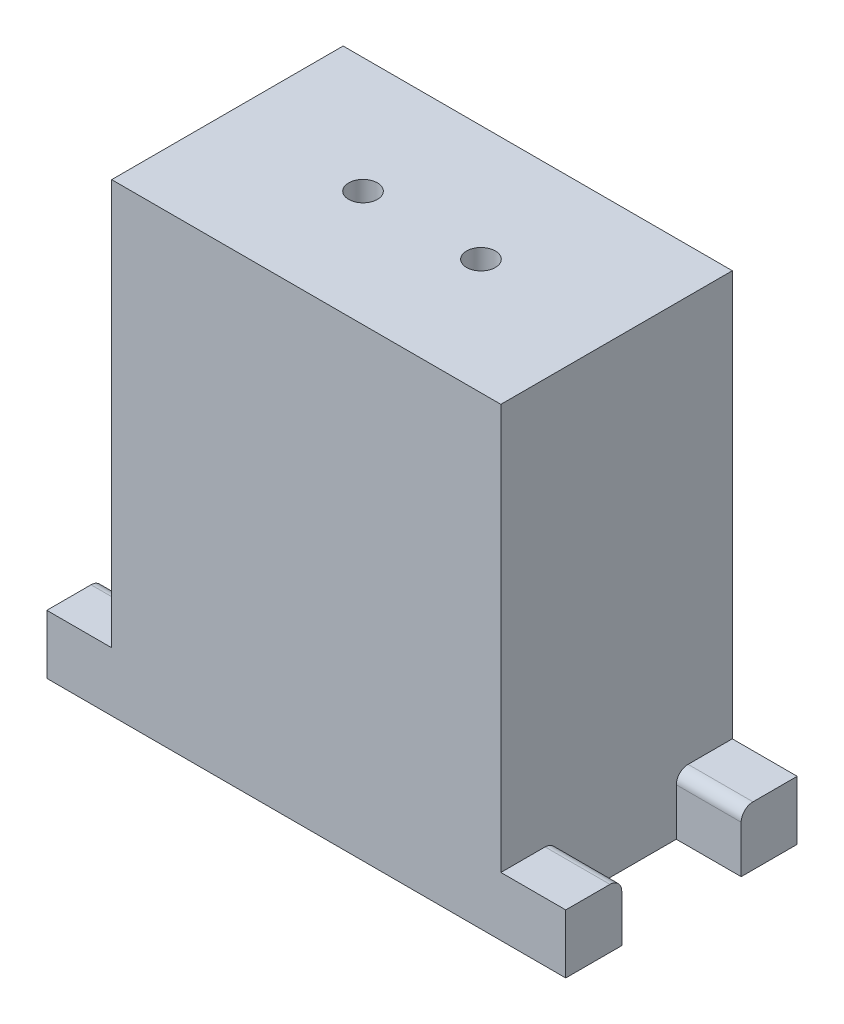
ISO-10303-21;
HEADER;
FILE_DESCRIPTION(('STEP AP214'),'2;1');
FILE_NAME('part.step','',(''),(''),'','','');
FILE_SCHEMA(('AUTOMOTIVE_DESIGN { 1 0 10303 214 1 1 1 1 }'));
ENDSEC;
DATA;
#1=APPLICATION_CONTEXT('core data for automotive mechanical design processes');
#2=APPLICATION_PROTOCOL_DEFINITION('international standard','automotive_design',2000,#1);
#3=PRODUCT_CONTEXT('',#1,'mechanical');
#4=PRODUCT('Part','Part','',(#3));
#5=PRODUCT_RELATED_PRODUCT_CATEGORY('part','',(#4));
#6=PRODUCT_DEFINITION_FORMATION('','',#4);
#7=PRODUCT_DEFINITION_CONTEXT('part definition',#1,'design');
#8=PRODUCT_DEFINITION('design','',#6,#7);
#9=PRODUCT_DEFINITION_SHAPE('','',#8);
#10=(LENGTH_UNIT() NAMED_UNIT(*) SI_UNIT(.MILLI.,.METRE.));
#11=(NAMED_UNIT(*) PLANE_ANGLE_UNIT() SI_UNIT($,.RADIAN.));
#12=(NAMED_UNIT(*) SI_UNIT($,.STERADIAN.) SOLID_ANGLE_UNIT());
#13=UNCERTAINTY_MEASURE_WITH_UNIT(LENGTH_MEASURE(1.E-05),#10,'distance_accuracy_value','');
#14=(GEOMETRIC_REPRESENTATION_CONTEXT(3) GLOBAL_UNCERTAINTY_ASSIGNED_CONTEXT((#13)) GLOBAL_UNIT_ASSIGNED_CONTEXT((#10,
#11,#12)) REPRESENTATION_CONTEXT('',''));
#15=CARTESIAN_POINT('',(0.,0.,0.));
#16=DIRECTION('',(0.,0.,1.));
#17=DIRECTION('',(1.,0.,0.));
#18=AXIS2_PLACEMENT_3D('',#15,#16,#17);
#19=CARTESIAN_POINT('',(-13.2,31.5,7.85));
#20=DIRECTION('',(1.,0.,0.));
#21=DIRECTION('',(0.,0.,-1.));
#22=AXIS2_PLACEMENT_3D('',#19,#20,#21);
#23=PLANE('',#22);
#24=DIRECTION('',(0.,1.,0.));
#25=VECTOR('',#24,1.);
#26=CARTESIAN_POINT('',(-13.2,4.,-4.05));
#27=LINE('',#26,#25);
#28=CARTESIAN_POINT('',(-13.2,0.,-4.05));
#29=VERTEX_POINT('',#28);
#30=CARTESIAN_POINT('',(-13.2,3.2,-4.05));
#31=VERTEX_POINT('',#30);
#32=EDGE_CURVE('E199',#29,#31,#27,.T.);
#33=ORIENTED_EDGE('',*,*,#32,.F.);
#34=DIRECTION('',(0.,0.,1.));
#35=VECTOR('',#34,1.);
#36=CARTESIAN_POINT('',(-13.2,0.,7.85));
#37=LINE('',#36,#35);
#38=CARTESIAN_POINT('',(-13.2,0.,4.05));
#39=VERTEX_POINT('',#38);
#40=EDGE_CURVE('E274',#29,#39,#37,.T.);
#41=ORIENTED_EDGE('',*,*,#40,.T.);
#42=DIRECTION('',(0.,-1.,0.));
#43=VECTOR('',#42,1.);
#44=CARTESIAN_POINT('',(-13.2,4.,4.05));
#45=LINE('',#44,#43);
#46=CARTESIAN_POINT('',(-13.2,3.2,4.05));
#47=VERTEX_POINT('',#46);
#48=EDGE_CURVE('E217',#47,#39,#45,.T.);
#49=ORIENTED_EDGE('',*,*,#48,.F.);
#50=CARTESIAN_POINT('',(-13.2,3.2,4.85));
#51=DIRECTION('',(1.,0.,0.));
#52=DIRECTION('',(0.,0.,-1.));
#53=AXIS2_PLACEMENT_3D('',#50,#51,#52);
#54=CIRCLE('',#53,0.8);
#55=CARTESIAN_POINT('',(-13.2,4.,4.85));
#56=VERTEX_POINT('',#55);
#57=EDGE_CURVE('E41',#47,#56,#54,.T.);
#58=ORIENTED_EDGE('',*,*,#57,.T.);
#59=DIRECTION('',(0.,0.,-1.));
#60=VECTOR('',#59,1.);
#61=CARTESIAN_POINT('',(-13.2,4.,4.05));
#62=LINE('',#61,#60);
#63=CARTESIAN_POINT('',(-13.2,4.,7.85));
#64=VERTEX_POINT('',#63);
#65=EDGE_CURVE('E212',#64,#56,#62,.T.);
#66=ORIENTED_EDGE('',*,*,#65,.F.);
#67=DIRECTION('',(0.,-1.,0.));
#68=VECTOR('',#67,1.);
#69=CARTESIAN_POINT('',(-13.2,31.5,7.85));
#70=LINE('',#69,#68);
#71=CARTESIAN_POINT('',(-13.2,31.5,7.85));
#72=VERTEX_POINT('',#71);
#73=EDGE_CURVE('E298',#72,#64,#70,.T.);
#74=ORIENTED_EDGE('',*,*,#73,.F.);
#75=DIRECTION('',(0.,0.,1.));
#76=VECTOR('',#75,1.);
#77=CARTESIAN_POINT('',(-13.2,31.5,7.85));
#78=LINE('',#77,#76);
#79=CARTESIAN_POINT('',(-13.2,31.5,-7.85));
#80=VERTEX_POINT('',#79);
#81=EDGE_CURVE('E182',#80,#72,#78,.T.);
#82=ORIENTED_EDGE('',*,*,#81,.F.);
#83=DIRECTION('',(0.,-1.,0.));
#84=VECTOR('',#83,1.);
#85=CARTESIAN_POINT('',(-13.2,31.5,-7.85));
#86=LINE('',#85,#84);
#87=CARTESIAN_POINT('',(-13.2,4.,-7.85));
#88=VERTEX_POINT('',#87);
#89=EDGE_CURVE('E283',#80,#88,#86,.T.);
#90=ORIENTED_EDGE('',*,*,#89,.T.);
#91=DIRECTION('',(0.,0.,-1.));
#92=VECTOR('',#91,1.);
#93=CARTESIAN_POINT('',(-13.2,4.,-4.05));
#94=LINE('',#93,#92);
#95=CARTESIAN_POINT('',(-13.2,4.,-4.85));
#96=VERTEX_POINT('',#95);
#97=EDGE_CURVE('E197',#96,#88,#94,.T.);
#98=ORIENTED_EDGE('',*,*,#97,.F.);
#99=CARTESIAN_POINT('',(-13.2,3.2,-4.85));
#100=DIRECTION('',(1.,0.,0.));
#101=DIRECTION('',(0.,0.,-1.));
#102=AXIS2_PLACEMENT_3D('',#99,#100,#101);
#103=CIRCLE('',#102,0.8);
#104=EDGE_CURVE('E11',#96,#31,#103,.T.);
#105=ORIENTED_EDGE('',*,*,#104,.T.);
#106=EDGE_LOOP('',(#33,#41,#49,#58,#66,#74,#82,#90,#98,#105));
#107=FACE_BOUND('',#106,.T.);
#108=ADVANCED_FACE('F33',(#107),#23,.F.);
#109=CARTESIAN_POINT('',(13.2,31.5,7.85));
#110=DIRECTION('',(-1.,0.,0.));
#111=DIRECTION('',(0.,0.,1.));
#112=AXIS2_PLACEMENT_3D('',#109,#110,#111);
#113=PLANE('',#112);
#114=DIRECTION('',(0.,0.,1.));
#115=VECTOR('',#114,1.);
#116=CARTESIAN_POINT('',(13.2,4.,-4.05));
#117=LINE('',#116,#115);
#118=CARTESIAN_POINT('',(13.2,4.,-7.85));
#119=VERTEX_POINT('',#118);
#120=CARTESIAN_POINT('',(13.2,4.,-4.85));
#121=VERTEX_POINT('',#120);
#122=EDGE_CURVE('E234',#119,#121,#117,.T.);
#123=ORIENTED_EDGE('',*,*,#122,.F.);
#124=DIRECTION('',(0.,-1.,0.));
#125=VECTOR('',#124,1.);
#126=CARTESIAN_POINT('',(13.2,31.5,-7.85));
#127=LINE('',#126,#125);
#128=CARTESIAN_POINT('',(13.2,31.5,-7.85));
#129=VERTEX_POINT('',#128);
#130=EDGE_CURVE('E292',#129,#119,#127,.T.);
#131=ORIENTED_EDGE('',*,*,#130,.F.);
#132=DIRECTION('',(0.,0.,-1.));
#133=VECTOR('',#132,1.);
#134=CARTESIAN_POINT('',(13.2,31.5,7.85));
#135=LINE('',#134,#133);
#136=CARTESIAN_POINT('',(13.2,31.5,7.85));
#137=VERTEX_POINT('',#136);
#138=EDGE_CURVE('E279',#137,#129,#135,.T.);
#139=ORIENTED_EDGE('',*,*,#138,.F.);
#140=DIRECTION('',(0.,-1.,0.));
#141=VECTOR('',#140,1.);
#142=CARTESIAN_POINT('',(13.2,31.5,7.85));
#143=LINE('',#142,#141);
#144=CARTESIAN_POINT('',(13.2,4.,7.85));
#145=VERTEX_POINT('',#144);
#146=EDGE_CURVE('E295',#137,#145,#143,.T.);
#147=ORIENTED_EDGE('',*,*,#146,.T.);
#148=DIRECTION('',(0.,0.,1.));
#149=VECTOR('',#148,1.);
#150=CARTESIAN_POINT('',(13.2,4.,4.05));
#151=LINE('',#150,#149);
#152=CARTESIAN_POINT('',(13.2,4.,4.85));
#153=VERTEX_POINT('',#152);
#154=EDGE_CURVE('E258',#153,#145,#151,.T.);
#155=ORIENTED_EDGE('',*,*,#154,.F.);
#156=CARTESIAN_POINT('',(13.2,3.2,4.85));
#157=DIRECTION('',(-1.,0.,0.));
#158=DIRECTION('',(0.,0.,1.));
#159=AXIS2_PLACEMENT_3D('',#156,#157,#158);
#160=CIRCLE('',#159,0.8);
#161=CARTESIAN_POINT('',(13.2,3.2,4.05));
#162=VERTEX_POINT('',#161);
#163=EDGE_CURVE('E328',#153,#162,#160,.T.);
#164=ORIENTED_EDGE('',*,*,#163,.T.);
#165=DIRECTION('',(0.,1.,0.));
#166=VECTOR('',#165,1.);
#167=CARTESIAN_POINT('',(13.2,4.,4.05));
#168=LINE('',#167,#166);
#169=CARTESIAN_POINT('',(13.2,0.,4.05));
#170=VERTEX_POINT('',#169);
#171=EDGE_CURVE('E253',#170,#162,#168,.T.);
#172=ORIENTED_EDGE('',*,*,#171,.F.);
#173=DIRECTION('',(0.,0.,-1.));
#174=VECTOR('',#173,1.);
#175=CARTESIAN_POINT('',(13.2,0.,7.85));
#176=LINE('',#175,#174);
#177=CARTESIAN_POINT('',(13.2,0.,-4.05));
#178=VERTEX_POINT('',#177);
#179=EDGE_CURVE('E183',#170,#178,#176,.T.);
#180=ORIENTED_EDGE('',*,*,#179,.T.);
#181=DIRECTION('',(0.,-1.,0.));
#182=VECTOR('',#181,1.);
#183=CARTESIAN_POINT('',(13.2,4.,-4.05));
#184=LINE('',#183,#182);
#185=CARTESIAN_POINT('',(13.2,3.2,-4.05));
#186=VERTEX_POINT('',#185);
#187=EDGE_CURVE('E237',#186,#178,#184,.T.);
#188=ORIENTED_EDGE('',*,*,#187,.F.);
#189=CARTESIAN_POINT('',(13.2,3.2,-4.85));
#190=DIRECTION('',(-1.,0.,0.));
#191=DIRECTION('',(0.,0.,1.));
#192=AXIS2_PLACEMENT_3D('',#189,#190,#191);
#193=CIRCLE('',#192,0.8);
#194=EDGE_CURVE('E330',#186,#121,#193,.T.);
#195=ORIENTED_EDGE('',*,*,#194,.T.);
#196=EDGE_LOOP('',(#123,#131,#139,#147,#155,#164,#172,#180,#188,#195));
#197=FACE_BOUND('',#196,.T.);
#198=ADVANCED_FACE('F376',(#197),#113,.F.);
#199=CARTESIAN_POINT('',(13.2,31.5,7.85));
#200=DIRECTION('',(0.,0.,-1.));
#201=DIRECTION('',(-1.,0.,0.));
#202=AXIS2_PLACEMENT_3D('',#199,#200,#201);
#203=PLANE('',#202);
#204=DIRECTION('',(1.,0.,0.));
#205=VECTOR('',#204,1.);
#206=CARTESIAN_POINT('',(13.2,0.,7.85));
#207=LINE('',#206,#205);
#208=CARTESIAN_POINT('',(-17.6,0.,7.85));
#209=VERTEX_POINT('',#208);
#210=CARTESIAN_POINT('',(17.6,0.,7.85));
#211=VERTEX_POINT('',#210);
#212=EDGE_CURVE('E286',#209,#211,#207,.T.);
#213=ORIENTED_EDGE('',*,*,#212,.T.);
#214=DIRECTION('',(0.,-1.,0.));
#215=VECTOR('',#214,1.);
#216=CARTESIAN_POINT('',(17.6,4.,7.85));
#217=LINE('',#216,#215);
#218=CARTESIAN_POINT('',(17.6,4.,7.85));
#219=VERTEX_POINT('',#218);
#220=EDGE_CURVE('E254',#219,#211,#217,.T.);
#221=ORIENTED_EDGE('',*,*,#220,.F.);
#222=DIRECTION('',(-1.,0.,0.));
#223=VECTOR('',#222,1.);
#224=CARTESIAN_POINT('',(17.6,4.,7.85));
#225=LINE('',#224,#223);
#226=EDGE_CURVE('E265',#219,#145,#225,.T.);
#227=ORIENTED_EDGE('',*,*,#226,.T.);
#228=ORIENTED_EDGE('',*,*,#146,.F.);
#229=DIRECTION('',(1.,0.,0.));
#230=VECTOR('',#229,1.);
#231=CARTESIAN_POINT('',(13.2,31.5,7.85));
#232=LINE('',#231,#230);
#233=EDGE_CURVE('E277',#72,#137,#232,.T.);
#234=ORIENTED_EDGE('',*,*,#233,.F.);
#235=ORIENTED_EDGE('',*,*,#73,.T.);
#236=DIRECTION('',(1.,0.,0.));
#237=VECTOR('',#236,1.);
#238=CARTESIAN_POINT('',(-17.6,4.,7.85));
#239=LINE('',#238,#237);
#240=CARTESIAN_POINT('',(-17.6,4.,7.85));
#241=VERTEX_POINT('',#240);
#242=EDGE_CURVE('E231',#241,#64,#239,.T.);
#243=ORIENTED_EDGE('',*,*,#242,.F.);
#244=DIRECTION('',(0.,1.,0.));
#245=VECTOR('',#244,1.);
#246=CARTESIAN_POINT('',(-17.6,4.,7.85));
#247=LINE('',#246,#245);
#248=EDGE_CURVE('E213',#209,#241,#247,.T.);
#249=ORIENTED_EDGE('',*,*,#248,.F.);
#250=EDGE_LOOP('',(#213,#221,#227,#228,#234,#235,#243,#249));
#251=FACE_BOUND('',#250,.T.);
#252=ADVANCED_FACE('F351',(#251),#203,.F.);
#253=CARTESIAN_POINT('',(13.2,31.5,-7.85));
#254=DIRECTION('',(0.,0.,1.));
#255=DIRECTION('',(1.,0.,0.));
#256=AXIS2_PLACEMENT_3D('',#253,#254,#255);
#257=PLANE('',#256);
#258=DIRECTION('',(-1.,0.,0.));
#259=VECTOR('',#258,1.);
#260=CARTESIAN_POINT('',(13.2,0.,-7.85));
#261=LINE('',#260,#259);
#262=CARTESIAN_POINT('',(17.6,0.,-7.85));
#263=VERTEX_POINT('',#262);
#264=CARTESIAN_POINT('',(-17.6,0.,-7.85));
#265=VERTEX_POINT('',#264);
#266=EDGE_CURVE('E170',#263,#265,#261,.T.);
#267=ORIENTED_EDGE('',*,*,#266,.T.);
#268=DIRECTION('',(0.,-1.,0.));
#269=VECTOR('',#268,1.);
#270=CARTESIAN_POINT('',(-17.6,4.,-7.85));
#271=LINE('',#270,#269);
#272=CARTESIAN_POINT('',(-17.6,4.,-7.85));
#273=VERTEX_POINT('',#272);
#274=EDGE_CURVE('E175',#273,#265,#271,.T.);
#275=ORIENTED_EDGE('',*,*,#274,.F.);
#276=DIRECTION('',(1.,0.,0.));
#277=VECTOR('',#276,1.);
#278=CARTESIAN_POINT('',(-17.6,4.,-7.85));
#279=LINE('',#278,#277);
#280=EDGE_CURVE('E207',#273,#88,#279,.T.);
#281=ORIENTED_EDGE('',*,*,#280,.T.);
#282=ORIENTED_EDGE('',*,*,#89,.F.);
#283=DIRECTION('',(-1.,0.,0.));
#284=VECTOR('',#283,1.);
#285=CARTESIAN_POINT('',(13.2,31.5,-7.85));
#286=LINE('',#285,#284);
#287=EDGE_CURVE('E281',#129,#80,#286,.T.);
#288=ORIENTED_EDGE('',*,*,#287,.F.);
#289=ORIENTED_EDGE('',*,*,#130,.T.);
#290=DIRECTION('',(-1.,0.,0.));
#291=VECTOR('',#290,1.);
#292=CARTESIAN_POINT('',(17.6,4.,-7.85));
#293=LINE('',#292,#291);
#294=CARTESIAN_POINT('',(17.6,4.,-7.85));
#295=VERTEX_POINT('',#294);
#296=EDGE_CURVE('E250',#295,#119,#293,.T.);
#297=ORIENTED_EDGE('',*,*,#296,.F.);
#298=DIRECTION('',(0.,1.,0.));
#299=VECTOR('',#298,1.);
#300=CARTESIAN_POINT('',(17.6,4.,-7.85));
#301=LINE('',#300,#299);
#302=EDGE_CURVE('E178',#263,#295,#301,.T.);
#303=ORIENTED_EDGE('',*,*,#302,.F.);
#304=EDGE_LOOP('',(#267,#275,#281,#282,#288,#289,#297,#303));
#305=FACE_BOUND('',#304,.T.);
#306=ADVANCED_FACE('F172',(#305),#257,.F.);
#307=CARTESIAN_POINT('',(0.,31.5,0.));
#308=DIRECTION('',(0.,1.,0.));
#309=DIRECTION('',(0.,0.,1.));
#310=AXIS2_PLACEMENT_3D('',#307,#308,#309);
#311=PLANE('',#310);
#312=CARTESIAN_POINT('',(4.,31.5,0.));
#313=DIRECTION('',(0.,-1.,0.));
#314=DIRECTION('',(0.,0.,-1.));
#315=AXIS2_PLACEMENT_3D('',#312,#313,#314);
#316=CIRCLE('',#315,0.975);
#317=CARTESIAN_POINT('',(4.,31.5,-0.975000000000001));
#318=VERTEX_POINT('',#317);
#319=EDGE_CURVE('E208',#318,#318,#316,.T.);
#320=ORIENTED_EDGE('',*,*,#319,.T.);
#321=EDGE_LOOP('',(#320));
#322=FACE_BOUND('',#321,.T.);
#323=CARTESIAN_POINT('',(-4.,31.5,0.));
#324=DIRECTION('',(0.,-1.,0.));
#325=DIRECTION('',(0.,0.,-1.));
#326=AXIS2_PLACEMENT_3D('',#323,#324,#325);
#327=CIRCLE('',#326,0.975);
#328=CARTESIAN_POINT('',(-4.,31.5,-0.975000000000002));
#329=VERTEX_POINT('',#328);
#330=EDGE_CURVE('E583',#329,#329,#327,.T.);
#331=ORIENTED_EDGE('',*,*,#330,.T.);
#332=EDGE_LOOP('',(#331));
#333=FACE_BOUND('',#332,.T.);
#334=ORIENTED_EDGE('',*,*,#81,.T.);
#335=ORIENTED_EDGE('',*,*,#233,.T.);
#336=ORIENTED_EDGE('',*,*,#138,.T.);
#337=ORIENTED_EDGE('',*,*,#287,.T.);
#338=EDGE_LOOP('',(#334,#335,#336,#337));
#339=FACE_BOUND('',#338,.T.);
#340=ADVANCED_FACE('F357',(#322,#333,#339),#311,.T.);
#341=CARTESIAN_POINT('',(0.,0.,0.));
#342=DIRECTION('',(0.,1.,0.));
#343=DIRECTION('',(0.,0.,1.));
#344=AXIS2_PLACEMENT_3D('',#341,#342,#343);
#345=PLANE('',#344);
#346=CARTESIAN_POINT('',(4.,0.,0.));
#347=DIRECTION('',(0.,-1.,0.));
#348=DIRECTION('',(0.,0.,-1.));
#349=AXIS2_PLACEMENT_3D('',#346,#347,#348);
#350=CIRCLE('',#349,0.975);
#351=CARTESIAN_POINT('',(4.,0.,-0.975000000000001));
#352=VERTEX_POINT('',#351);
#353=EDGE_CURVE('E582',#352,#352,#350,.T.);
#354=ORIENTED_EDGE('',*,*,#353,.F.);
#355=EDGE_LOOP('',(#354));
#356=FACE_BOUND('',#355,.T.);
#357=CARTESIAN_POINT('',(-4.,0.,0.));
#358=DIRECTION('',(0.,-1.,0.));
#359=DIRECTION('',(0.,0.,-1.));
#360=AXIS2_PLACEMENT_3D('',#357,#358,#359);
#361=CIRCLE('',#360,0.975);
#362=CARTESIAN_POINT('',(-4.,0.,-0.975000000000002));
#363=VERTEX_POINT('',#362);
#364=EDGE_CURVE('E202',#363,#363,#361,.T.);
#365=ORIENTED_EDGE('',*,*,#364,.F.);
#366=EDGE_LOOP('',(#365));
#367=FACE_BOUND('',#366,.T.);
#368=ORIENTED_EDGE('',*,*,#40,.F.);
#369=DIRECTION('',(1.,0.,0.));
#370=VECTOR('',#369,1.);
#371=CARTESIAN_POINT('',(-17.6,0.,-4.05));
#372=LINE('',#371,#370);
#373=CARTESIAN_POINT('',(-17.6,0.,-4.05));
#374=VERTEX_POINT('',#373);
#375=EDGE_CURVE('E189',#374,#29,#372,.T.);
#376=ORIENTED_EDGE('',*,*,#375,.F.);
#377=DIRECTION('',(0.,0.,1.));
#378=VECTOR('',#377,1.);
#379=CARTESIAN_POINT('',(-17.6,0.,-4.05));
#380=LINE('',#379,#378);
#381=EDGE_CURVE('E186',#265,#374,#380,.T.);
#382=ORIENTED_EDGE('',*,*,#381,.F.);
#383=ORIENTED_EDGE('',*,*,#266,.F.);
#384=DIRECTION('',(0.,0.,-1.));
#385=VECTOR('',#384,1.);
#386=CARTESIAN_POINT('',(17.6,0.,-4.05));
#387=LINE('',#386,#385);
#388=CARTESIAN_POINT('',(17.6,0.,-4.05));
#389=VERTEX_POINT('',#388);
#390=EDGE_CURVE('E242',#389,#263,#387,.T.);
#391=ORIENTED_EDGE('',*,*,#390,.F.);
#392=DIRECTION('',(-1.,0.,0.));
#393=VECTOR('',#392,1.);
#394=CARTESIAN_POINT('',(17.6,0.,-4.05));
#395=LINE('',#394,#393);
#396=EDGE_CURVE('E244',#389,#178,#395,.T.);
#397=ORIENTED_EDGE('',*,*,#396,.T.);
#398=ORIENTED_EDGE('',*,*,#179,.F.);
#399=DIRECTION('',(-1.,0.,0.));
#400=VECTOR('',#399,1.);
#401=CARTESIAN_POINT('',(17.6,0.,4.05));
#402=LINE('',#401,#400);
#403=CARTESIAN_POINT('',(17.6,0.,4.05));
#404=VERTEX_POINT('',#403);
#405=EDGE_CURVE('E271',#404,#170,#402,.T.);
#406=ORIENTED_EDGE('',*,*,#405,.F.);
#407=DIRECTION('',(0.,0.,-1.));
#408=VECTOR('',#407,1.);
#409=CARTESIAN_POINT('',(17.6,0.,4.05));
#410=LINE('',#409,#408);
#411=EDGE_CURVE('E257',#211,#404,#410,.T.);
#412=ORIENTED_EDGE('',*,*,#411,.F.);
#413=ORIENTED_EDGE('',*,*,#212,.F.);
#414=DIRECTION('',(0.,0.,1.));
#415=VECTOR('',#414,1.);
#416=CARTESIAN_POINT('',(-17.6,0.,4.05));
#417=LINE('',#416,#415);
#418=CARTESIAN_POINT('',(-17.6,0.,4.05));
#419=VERTEX_POINT('',#418);
#420=EDGE_CURVE('E222',#419,#209,#417,.T.);
#421=ORIENTED_EDGE('',*,*,#420,.F.);
#422=DIRECTION('',(1.,0.,0.));
#423=VECTOR('',#422,1.);
#424=CARTESIAN_POINT('',(-17.6,0.,4.05));
#425=LINE('',#424,#423);
#426=EDGE_CURVE('E225',#419,#39,#425,.T.);
#427=ORIENTED_EDGE('',*,*,#426,.T.);
#428=EDGE_LOOP('',(#368,#376,#382,#383,#391,#397,#398,#406,#412,#413,#421,#427));
#429=FACE_BOUND('',#428,.T.);
#430=ADVANCED_FACE('F187',(#356,#367,#429),#345,.F.);
#431=CARTESIAN_POINT('',(17.6,4.,4.05));
#432=DIRECTION('',(0.,0.,1.));
#433=DIRECTION('',(0.,-1.,0.));
#434=AXIS2_PLACEMENT_3D('',#431,#432,#433);
#435=PLANE('',#434);
#436=ORIENTED_EDGE('',*,*,#171,.T.);
#437=DIRECTION('',(-1.,0.,0.));
#438=VECTOR('',#437,1.);
#439=CARTESIAN_POINT('',(17.6,3.2,4.05));
#440=LINE('',#439,#438);
#441=CARTESIAN_POINT('',(17.6,3.2,4.05));
#442=VERTEX_POINT('',#441);
#443=EDGE_CURVE('E304',#162,#442,#440,.F.);
#444=ORIENTED_EDGE('',*,*,#443,.T.);
#445=DIRECTION('',(0.,1.,0.));
#446=VECTOR('',#445,1.);
#447=CARTESIAN_POINT('',(17.6,4.,4.05));
#448=LINE('',#447,#446);
#449=EDGE_CURVE('E260',#404,#442,#448,.T.);
#450=ORIENTED_EDGE('',*,*,#449,.F.);
#451=ORIENTED_EDGE('',*,*,#405,.T.);
#452=EDGE_LOOP('',(#436,#444,#450,#451));
#453=FACE_BOUND('',#452,.T.);
#454=ADVANCED_FACE('F513',(#453),#435,.F.);
#455=CARTESIAN_POINT('',(17.6,4.,4.05));
#456=DIRECTION('',(0.,-1.,0.));
#457=DIRECTION('',(0.,0.,-1.));
#458=AXIS2_PLACEMENT_3D('',#455,#456,#457);
#459=PLANE('',#458);
#460=DIRECTION('',(0.,0.,1.));
#461=VECTOR('',#460,1.);
#462=CARTESIAN_POINT('',(17.6,4.,4.05));
#463=LINE('',#462,#461);
#464=CARTESIAN_POINT('',(17.6,4.,4.85));
#465=VERTEX_POINT('',#464);
#466=EDGE_CURVE('E263',#465,#219,#463,.T.);
#467=ORIENTED_EDGE('',*,*,#466,.F.);
#468=DIRECTION('',(-1.,0.,0.));
#469=VECTOR('',#468,1.);
#470=CARTESIAN_POINT('',(17.6,4.,4.85));
#471=LINE('',#470,#469);
#472=EDGE_CURVE('E301',#465,#153,#471,.T.);
#473=ORIENTED_EDGE('',*,*,#472,.T.);
#474=ORIENTED_EDGE('',*,*,#154,.T.);
#475=ORIENTED_EDGE('',*,*,#226,.F.);
#476=EDGE_LOOP('',(#467,#473,#474,#475));
#477=FACE_BOUND('',#476,.T.);
#478=ADVANCED_FACE('F503',(#477),#459,.F.);
#479=CARTESIAN_POINT('',(17.6,0.,0.));
#480=DIRECTION('',(-1.,0.,0.));
#481=DIRECTION('',(0.,0.,1.));
#482=AXIS2_PLACEMENT_3D('',#479,#480,#481);
#483=PLANE('',#482);
#484=ORIENTED_EDGE('',*,*,#449,.T.);
#485=CARTESIAN_POINT('',(17.6,3.2,4.85));
#486=DIRECTION('',(-1.,0.,0.));
#487=DIRECTION('',(0.,0.,1.));
#488=AXIS2_PLACEMENT_3D('',#485,#486,#487);
#489=CIRCLE('',#488,0.8);
#490=EDGE_CURVE('E306',#442,#465,#489,.F.);
#491=ORIENTED_EDGE('',*,*,#490,.T.);
#492=ORIENTED_EDGE('',*,*,#466,.T.);
#493=ORIENTED_EDGE('',*,*,#220,.T.);
#494=ORIENTED_EDGE('',*,*,#411,.T.);
#495=EDGE_LOOP('',(#484,#491,#492,#493,#494));
#496=FACE_BOUND('',#495,.T.);
#497=ADVANCED_FACE('F493',(#496),#483,.F.);
#498=CARTESIAN_POINT('',(17.6,4.,-4.05));
#499=DIRECTION('',(0.,-1.,0.));
#500=DIRECTION('',(0.,0.,-1.));
#501=AXIS2_PLACEMENT_3D('',#498,#499,#500);
#502=PLANE('',#501);
#503=ORIENTED_EDGE('',*,*,#122,.T.);
#504=DIRECTION('',(-1.,0.,0.));
#505=VECTOR('',#504,1.);
#506=CARTESIAN_POINT('',(17.6,4.,-4.85));
#507=LINE('',#506,#505);
#508=CARTESIAN_POINT('',(17.6,4.,-4.85));
#509=VERTEX_POINT('',#508);
#510=EDGE_CURVE('E311',#121,#509,#507,.F.);
#511=ORIENTED_EDGE('',*,*,#510,.T.);
#512=DIRECTION('',(0.,0.,1.));
#513=VECTOR('',#512,1.);
#514=CARTESIAN_POINT('',(17.6,4.,-4.05));
#515=LINE('',#514,#513);
#516=EDGE_CURVE('E236',#295,#509,#515,.T.);
#517=ORIENTED_EDGE('',*,*,#516,.F.);
#518=ORIENTED_EDGE('',*,*,#296,.T.);
#519=EDGE_LOOP('',(#503,#511,#517,#518));
#520=FACE_BOUND('',#519,.T.);
#521=ADVANCED_FACE('F483',(#520),#502,.F.);
#522=CARTESIAN_POINT('',(17.6,4.,-4.05));
#523=DIRECTION('',(0.,0.,-1.));
#524=DIRECTION('',(0.,1.,0.));
#525=AXIS2_PLACEMENT_3D('',#522,#523,#524);
#526=PLANE('',#525);
#527=DIRECTION('',(0.,-1.,0.));
#528=VECTOR('',#527,1.);
#529=CARTESIAN_POINT('',(17.6,4.,-4.05));
#530=LINE('',#529,#528);
#531=CARTESIAN_POINT('',(17.6,3.2,-4.05));
#532=VERTEX_POINT('',#531);
#533=EDGE_CURVE('E240',#532,#389,#530,.T.);
#534=ORIENTED_EDGE('',*,*,#533,.F.);
#535=DIRECTION('',(-1.,0.,0.));
#536=VECTOR('',#535,1.);
#537=CARTESIAN_POINT('',(17.6,3.2,-4.05));
#538=LINE('',#537,#536);
#539=EDGE_CURVE('E308',#532,#186,#538,.T.);
#540=ORIENTED_EDGE('',*,*,#539,.T.);
#541=ORIENTED_EDGE('',*,*,#187,.T.);
#542=ORIENTED_EDGE('',*,*,#396,.F.);
#543=EDGE_LOOP('',(#534,#540,#541,#542));
#544=FACE_BOUND('',#543,.T.);
#545=ADVANCED_FACE('F472',(#544),#526,.F.);
#546=CARTESIAN_POINT('',(17.6,0.,0.));
#547=DIRECTION('',(1.,0.,0.));
#548=DIRECTION('',(0.,0.,-1.));
#549=AXIS2_PLACEMENT_3D('',#546,#547,#548);
#550=PLANE('',#549);
#551=ORIENTED_EDGE('',*,*,#516,.T.);
#552=CARTESIAN_POINT('',(17.6,3.2,-4.85));
#553=DIRECTION('',(1.,0.,0.));
#554=DIRECTION('',(0.,0.,-1.));
#555=AXIS2_PLACEMENT_3D('',#552,#553,#554);
#556=CIRCLE('',#555,0.8);
#557=EDGE_CURVE('E313',#509,#532,#556,.T.);
#558=ORIENTED_EDGE('',*,*,#557,.T.);
#559=ORIENTED_EDGE('',*,*,#533,.T.);
#560=ORIENTED_EDGE('',*,*,#390,.T.);
#561=ORIENTED_EDGE('',*,*,#302,.T.);
#562=EDGE_LOOP('',(#551,#558,#559,#560,#561));
#563=FACE_BOUND('',#562,.T.);
#564=ADVANCED_FACE('F462',(#563),#550,.T.);
#565=CARTESIAN_POINT('',(-17.6,4.,4.05));
#566=DIRECTION('',(0.,-1.,0.));
#567=DIRECTION('',(0.,0.,-1.));
#568=AXIS2_PLACEMENT_3D('',#565,#566,#567);
#569=PLANE('',#568);
#570=ORIENTED_EDGE('',*,*,#65,.T.);
#571=DIRECTION('',(1.,0.,0.));
#572=VECTOR('',#571,1.);
#573=CARTESIAN_POINT('',(-17.6,4.,4.85));
#574=LINE('',#573,#572);
#575=CARTESIAN_POINT('',(-17.6,4.,4.85));
#576=VERTEX_POINT('',#575);
#577=EDGE_CURVE('E318',#56,#576,#574,.F.);
#578=ORIENTED_EDGE('',*,*,#577,.T.);
#579=DIRECTION('',(0.,0.,-1.));
#580=VECTOR('',#579,1.);
#581=CARTESIAN_POINT('',(-17.6,4.,4.05));
#582=LINE('',#581,#580);
#583=EDGE_CURVE('E216',#241,#576,#582,.T.);
#584=ORIENTED_EDGE('',*,*,#583,.F.);
#585=ORIENTED_EDGE('',*,*,#242,.T.);
#586=EDGE_LOOP('',(#570,#578,#584,#585));
#587=FACE_BOUND('',#586,.T.);
#588=ADVANCED_FACE('F337',(#587),#569,.F.);
#589=CARTESIAN_POINT('',(-17.6,4.,4.05));
#590=DIRECTION('',(0.,0.,1.));
#591=DIRECTION('',(1.,0.,0.));
#592=AXIS2_PLACEMENT_3D('',#589,#590,#591);
#593=PLANE('',#592);
#594=DIRECTION('',(0.,-1.,0.));
#595=VECTOR('',#594,1.);
#596=CARTESIAN_POINT('',(-17.6,4.,4.05));
#597=LINE('',#596,#595);
#598=CARTESIAN_POINT('',(-17.6,3.2,4.05));
#599=VERTEX_POINT('',#598);
#600=EDGE_CURVE('E220',#599,#419,#597,.T.);
#601=ORIENTED_EDGE('',*,*,#600,.F.);
#602=DIRECTION('',(1.,0.,0.));
#603=VECTOR('',#602,1.);
#604=CARTESIAN_POINT('',(-17.6,3.2,4.05));
#605=LINE('',#604,#603);
#606=EDGE_CURVE('E315',#599,#47,#605,.T.);
#607=ORIENTED_EDGE('',*,*,#606,.T.);
#608=ORIENTED_EDGE('',*,*,#48,.T.);
#609=ORIENTED_EDGE('',*,*,#426,.F.);
#610=EDGE_LOOP('',(#601,#607,#608,#609));
#611=FACE_BOUND('',#610,.T.);
#612=ADVANCED_FACE('F346',(#611),#593,.F.);
#613=CARTESIAN_POINT('',(-17.6,0.,0.));
#614=DIRECTION('',(-1.,0.,0.));
#615=DIRECTION('',(0.,0.,1.));
#616=AXIS2_PLACEMENT_3D('',#613,#614,#615);
#617=PLANE('',#616);
#618=ORIENTED_EDGE('',*,*,#583,.T.);
#619=CARTESIAN_POINT('',(-17.6,3.2,4.85));
#620=DIRECTION('',(-1.,0.,0.));
#621=DIRECTION('',(0.,0.,1.));
#622=AXIS2_PLACEMENT_3D('',#619,#620,#621);
#623=CIRCLE('',#622,0.8);
#624=EDGE_CURVE('E320',#576,#599,#623,.T.);
#625=ORIENTED_EDGE('',*,*,#624,.T.);
#626=ORIENTED_EDGE('',*,*,#600,.T.);
#627=ORIENTED_EDGE('',*,*,#420,.T.);
#628=ORIENTED_EDGE('',*,*,#248,.T.);
#629=EDGE_LOOP('',(#618,#625,#626,#627,#628));
#630=FACE_BOUND('',#629,.T.);
#631=ADVANCED_FACE('F343',(#630),#617,.T.);
#632=CARTESIAN_POINT('',(-17.6,4.,-4.05));
#633=DIRECTION('',(0.,0.,-1.));
#634=DIRECTION('',(0.,1.,0.));
#635=AXIS2_PLACEMENT_3D('',#632,#633,#634);
#636=PLANE('',#635);
#637=ORIENTED_EDGE('',*,*,#32,.T.);
#638=DIRECTION('',(1.,0.,0.));
#639=VECTOR('',#638,1.);
#640=CARTESIAN_POINT('',(-17.6,3.2,-4.05));
#641=LINE('',#640,#639);
#642=CARTESIAN_POINT('',(-17.6,3.2,-4.05));
#643=VERTEX_POINT('',#642);
#644=EDGE_CURVE('E48',#31,#643,#641,.F.);
#645=ORIENTED_EDGE('',*,*,#644,.T.);
#646=DIRECTION('',(0.,1.,0.));
#647=VECTOR('',#646,1.);
#648=CARTESIAN_POINT('',(-17.6,4.,-4.05));
#649=LINE('',#648,#647);
#650=EDGE_CURVE('E191',#374,#643,#649,.T.);
#651=ORIENTED_EDGE('',*,*,#650,.F.);
#652=ORIENTED_EDGE('',*,*,#375,.T.);
#653=EDGE_LOOP('',(#637,#645,#651,#652));
#654=FACE_BOUND('',#653,.T.);
#655=ADVANCED_FACE('F366',(#654),#636,.F.);
#656=CARTESIAN_POINT('',(-17.6,4.,-4.05));
#657=DIRECTION('',(0.,-1.,0.));
#658=DIRECTION('',(0.,0.,-1.));
#659=AXIS2_PLACEMENT_3D('',#656,#657,#658);
#660=PLANE('',#659);
#661=DIRECTION('',(0.,0.,-1.));
#662=VECTOR('',#661,1.);
#663=CARTESIAN_POINT('',(-17.6,4.,-4.05));
#664=LINE('',#663,#662);
#665=CARTESIAN_POINT('',(-17.6,4.,-4.85));
#666=VERTEX_POINT('',#665);
#667=EDGE_CURVE('E195',#666,#273,#664,.T.);
#668=ORIENTED_EDGE('',*,*,#667,.F.);
#669=DIRECTION('',(1.,0.,0.));
#670=VECTOR('',#669,1.);
#671=CARTESIAN_POINT('',(-17.6,4.,-4.85));
#672=LINE('',#671,#670);
#673=EDGE_CURVE('E322',#666,#96,#672,.T.);
#674=ORIENTED_EDGE('',*,*,#673,.T.);
#675=ORIENTED_EDGE('',*,*,#97,.T.);
#676=ORIENTED_EDGE('',*,*,#280,.F.);
#677=EDGE_LOOP('',(#668,#674,#675,#676));
#678=FACE_BOUND('',#677,.T.);
#679=ADVANCED_FACE('F362',(#678),#660,.F.);
#680=CARTESIAN_POINT('',(-17.6,0.,0.));
#681=DIRECTION('',(1.,0.,0.));
#682=DIRECTION('',(0.,0.,-1.));
#683=AXIS2_PLACEMENT_3D('',#680,#681,#682);
#684=PLANE('',#683);
#685=ORIENTED_EDGE('',*,*,#650,.T.);
#686=CARTESIAN_POINT('',(-17.6,3.2,-4.85));
#687=DIRECTION('',(1.,0.,0.));
#688=DIRECTION('',(0.,0.,-1.));
#689=AXIS2_PLACEMENT_3D('',#686,#687,#688);
#690=CIRCLE('',#689,0.8);
#691=EDGE_CURVE('E326',#643,#666,#690,.F.);
#692=ORIENTED_EDGE('',*,*,#691,.T.);
#693=ORIENTED_EDGE('',*,*,#667,.T.);
#694=ORIENTED_EDGE('',*,*,#274,.T.);
#695=ORIENTED_EDGE('',*,*,#381,.T.);
#696=EDGE_LOOP('',(#685,#692,#693,#694,#695));
#697=FACE_BOUND('',#696,.T.);
#698=ADVANCED_FACE('F193',(#697),#684,.F.);
#699=CARTESIAN_POINT('',(-4.,31.5,0.));
#700=DIRECTION('',(0.,-1.,0.));
#701=DIRECTION('',(0.,0.,-1.));
#702=AXIS2_PLACEMENT_3D('',#699,#700,#701);
#703=CYLINDRICAL_SURFACE('',#702,0.975);
#704=ORIENTED_EDGE('',*,*,#330,.F.);
#705=EDGE_LOOP('',(#704));
#706=FACE_BOUND('',#705,.T.);
#707=ORIENTED_EDGE('',*,*,#364,.T.);
#708=EDGE_LOOP('',(#707));
#709=FACE_BOUND('',#708,.T.);
#710=ADVANCED_FACE('F427',(#706,#709),#703,.F.);
#711=CARTESIAN_POINT('',(4.,31.5,0.));
#712=DIRECTION('',(0.,-1.,0.));
#713=DIRECTION('',(0.,0.,-1.));
#714=AXIS2_PLACEMENT_3D('',#711,#712,#713);
#715=CYLINDRICAL_SURFACE('',#714,0.975);
#716=ORIENTED_EDGE('',*,*,#319,.F.);
#717=EDGE_LOOP('',(#716));
#718=FACE_BOUND('',#717,.T.);
#719=ORIENTED_EDGE('',*,*,#353,.T.);
#720=EDGE_LOOP('',(#719));
#721=FACE_BOUND('',#720,.T.);
#722=ADVANCED_FACE('F390',(#718,#721),#715,.F.);
#723=CARTESIAN_POINT('',(17.6,3.2,4.85));
#724=DIRECTION('',(-1.,0.,0.));
#725=DIRECTION('',(0.,0.,1.));
#726=AXIS2_PLACEMENT_3D('',#723,#724,#725);
#727=CYLINDRICAL_SURFACE('',#726,0.8);
#728=ORIENTED_EDGE('',*,*,#490,.F.);
#729=ORIENTED_EDGE('',*,*,#443,.F.);
#730=ORIENTED_EDGE('',*,*,#163,.F.);
#731=ORIENTED_EDGE('',*,*,#472,.F.);
#732=EDGE_LOOP('',(#728,#729,#730,#731));
#733=FACE_BOUND('',#732,.T.);
#734=ADVANCED_FACE('F386',(#733),#727,.T.);
#735=CARTESIAN_POINT('',(17.6,3.2,-4.85));
#736=DIRECTION('',(-1.,0.,0.));
#737=DIRECTION('',(0.,0.,1.));
#738=AXIS2_PLACEMENT_3D('',#735,#736,#737);
#739=CYLINDRICAL_SURFACE('',#738,0.8);
#740=ORIENTED_EDGE('',*,*,#557,.F.);
#741=ORIENTED_EDGE('',*,*,#510,.F.);
#742=ORIENTED_EDGE('',*,*,#194,.F.);
#743=ORIENTED_EDGE('',*,*,#539,.F.);
#744=EDGE_LOOP('',(#740,#741,#742,#743));
#745=FACE_BOUND('',#744,.T.);
#746=ADVANCED_FACE('F389',(#745),#739,.T.);
#747=CARTESIAN_POINT('',(-17.6,3.2,4.85));
#748=DIRECTION('',(1.,0.,0.));
#749=DIRECTION('',(0.,0.,-1.));
#750=AXIS2_PLACEMENT_3D('',#747,#748,#749);
#751=CYLINDRICAL_SURFACE('',#750,0.8);
#752=ORIENTED_EDGE('',*,*,#624,.F.);
#753=ORIENTED_EDGE('',*,*,#577,.F.);
#754=ORIENTED_EDGE('',*,*,#57,.F.);
#755=ORIENTED_EDGE('',*,*,#606,.F.);
#756=EDGE_LOOP('',(#752,#753,#754,#755));
#757=FACE_BOUND('',#756,.T.);
#758=ADVANCED_FACE('F340',(#757),#751,.T.);
#759=CARTESIAN_POINT('',(-17.6,3.2,-4.85));
#760=DIRECTION('',(1.,0.,0.));
#761=DIRECTION('',(0.,0.,-1.));
#762=AXIS2_PLACEMENT_3D('',#759,#760,#761);
#763=CYLINDRICAL_SURFACE('',#762,0.8);
#764=ORIENTED_EDGE('',*,*,#691,.F.);
#765=ORIENTED_EDGE('',*,*,#644,.F.);
#766=ORIENTED_EDGE('',*,*,#104,.F.);
#767=ORIENTED_EDGE('',*,*,#673,.F.);
#768=EDGE_LOOP('',(#764,#765,#766,#767));
#769=FACE_BOUND('',#768,.T.);
#770=ADVANCED_FACE('F35',(#769),#763,.T.);
#771=CLOSED_SHELL('',(#108,#198,#252,#306,#340,#430,#454,#478,#497,#521,#545,#564,#588,#612,
#631,#655,#679,#698,#710,#722,#734,#746,#758,#770));
#772=MANIFOLD_SOLID_BREP('B2',#771);
#773=ADVANCED_BREP_SHAPE_REPRESENTATION('',(#18,#772),#14);
#774=SHAPE_DEFINITION_REPRESENTATION(#9,#773);
ENDSEC;
END-ISO-10303-21;
